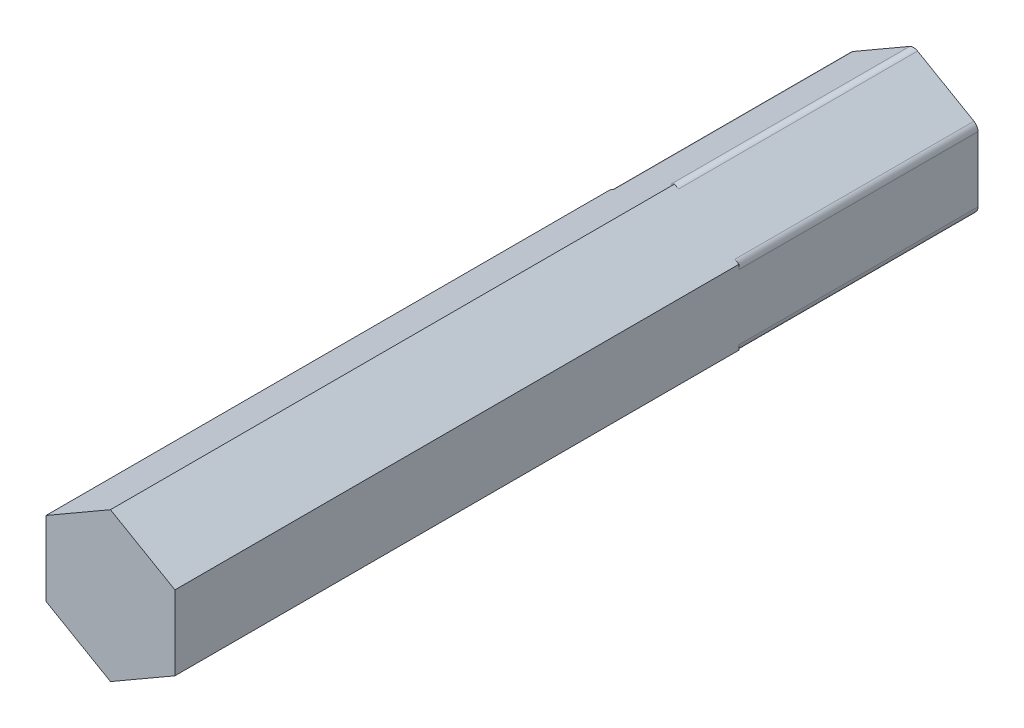
ISO-10303-21;
HEADER;
FILE_DESCRIPTION(('STEP AP214'),'2;1');
FILE_NAME('part.step','',(''),(''),'','','');
FILE_SCHEMA(('AUTOMOTIVE_DESIGN { 1 0 10303 214 1 1 1 1 }'));
ENDSEC;
DATA;
#1=APPLICATION_CONTEXT('core data for automotive mechanical design processes');
#2=APPLICATION_PROTOCOL_DEFINITION('international standard','automotive_design',2000,#1);
#3=PRODUCT_CONTEXT('',#1,'mechanical');
#4=PRODUCT('Part','Part','',(#3));
#5=PRODUCT_RELATED_PRODUCT_CATEGORY('part','',(#4));
#6=PRODUCT_DEFINITION_FORMATION('','',#4);
#7=PRODUCT_DEFINITION_CONTEXT('part definition',#1,'design');
#8=PRODUCT_DEFINITION('design','',#6,#7);
#9=PRODUCT_DEFINITION_SHAPE('','',#8);
#10=(LENGTH_UNIT() NAMED_UNIT(*) SI_UNIT(.MILLI.,.METRE.));
#11=(NAMED_UNIT(*) PLANE_ANGLE_UNIT() SI_UNIT($,.RADIAN.));
#12=(NAMED_UNIT(*) SI_UNIT($,.STERADIAN.) SOLID_ANGLE_UNIT());
#13=UNCERTAINTY_MEASURE_WITH_UNIT(LENGTH_MEASURE(1.E-05),#10,'distance_accuracy_value','');
#14=(GEOMETRIC_REPRESENTATION_CONTEXT(3) GLOBAL_UNCERTAINTY_ASSIGNED_CONTEXT((#13)) GLOBAL_UNIT_ASSIGNED_CONTEXT((#10,
#11,#12)) REPRESENTATION_CONTEXT('',''));
#15=CARTESIAN_POINT('',(0.,0.,0.));
#16=DIRECTION('',(0.,0.,1.));
#17=DIRECTION('',(1.,0.,0.));
#18=AXIS2_PLACEMENT_3D('',#15,#16,#17);
#19=CARTESIAN_POINT('',(12.,6.92820323027551,32.8394154211888));
#20=DIRECTION('',(0.5,0.866025403784439,0.));
#21=DIRECTION('',(-0.866025403784439,0.5,0.));
#22=AXIS2_PLACEMENT_3D('',#19,#20,#21);
#23=PLANE('',#22);
#24=DIRECTION('',(0.866025403784439,-0.5,0.));
#25=VECTOR('',#24,1.);
#26=CARTESIAN_POINT('',(12.,6.92820323027551,69.5000209808355));
#27=LINE('',#26,#25);
#28=CARTESIAN_POINT('',(0.749999999999999,13.4233937586588,69.5000209808355));
#29=VERTEX_POINT('',#28);
#30=CARTESIAN_POINT('',(11.25,7.36121593216773,69.5000209808355));
#31=VERTEX_POINT('',#30);
#32=EDGE_CURVE('E196',#29,#31,#27,.T.);
#33=ORIENTED_EDGE('',*,*,#32,.F.);
#34=DIRECTION('',(0.,0.,-1.));
#35=VECTOR('',#34,1.);
#36=CARTESIAN_POINT('',(0.750000000000003,13.4233937586588,114.000020980836));
#37=LINE('',#36,#35);
#38=CARTESIAN_POINT('',(0.750000000000003,13.4233937586588,114.000020980836));
#39=VERTEX_POINT('',#38);
#40=EDGE_CURVE('E186',#39,#29,#37,.T.);
#41=ORIENTED_EDGE('',*,*,#40,.F.);
#42=DIRECTION('',(-0.866025403784439,0.5,0.));
#43=VECTOR('',#42,1.);
#44=CARTESIAN_POINT('',(12.,6.92820323027551,114.000020980836));
#45=LINE('',#44,#43);
#46=CARTESIAN_POINT('',(0.,13.856406460551,114.000020980836));
#47=VERTEX_POINT('',#46);
#48=EDGE_CURVE('E172',#39,#47,#45,.T.);
#49=ORIENTED_EDGE('',*,*,#48,.T.);
#50=DIRECTION('',(0.,0.,1.));
#51=VECTOR('',#50,1.);
#52=CARTESIAN_POINT('',(0.,13.856406460551,32.8394154211888));
#53=LINE('',#52,#51);
#54=CARTESIAN_POINT('',(0.,13.856406460551,219.000011994922));
#55=VERTEX_POINT('',#54);
#56=EDGE_CURVE('E248',#47,#55,#53,.T.);
#57=ORIENTED_EDGE('',*,*,#56,.T.);
#58=DIRECTION('',(-0.866025403784439,0.5,0.));
#59=VECTOR('',#58,1.);
#60=CARTESIAN_POINT('',(12.,6.92820323027551,219.000011994922));
#61=LINE('',#60,#59);
#62=CARTESIAN_POINT('',(12.,6.92820323027551,219.000011994922));
#63=VERTEX_POINT('',#62);
#64=EDGE_CURVE('E230',#63,#55,#61,.T.);
#65=ORIENTED_EDGE('',*,*,#64,.F.);
#66=DIRECTION('',(0.,0.,1.));
#67=VECTOR('',#66,1.);
#68=CARTESIAN_POINT('',(12.,6.92820323027551,32.8394154211888));
#69=LINE('',#68,#67);
#70=CARTESIAN_POINT('',(12.,6.92820323027551,114.000020980836));
#71=VERTEX_POINT('',#70);
#72=EDGE_CURVE('E219',#71,#63,#69,.T.);
#73=ORIENTED_EDGE('',*,*,#72,.F.);
#74=CARTESIAN_POINT('',(11.25,7.36121593216773,114.000020980836));
#75=VERTEX_POINT('',#74);
#76=EDGE_CURVE('E183',#71,#75,#45,.T.);
#77=ORIENTED_EDGE('',*,*,#76,.T.);
#78=DIRECTION('',(0.,0.,-1.));
#79=VECTOR('',#78,1.);
#80=CARTESIAN_POINT('',(11.25,7.36121593216773,114.000020980836));
#81=LINE('',#80,#79);
#82=EDGE_CURVE('E311',#75,#31,#81,.T.);
#83=ORIENTED_EDGE('',*,*,#82,.T.);
#84=EDGE_LOOP('',(#33,#41,#49,#57,#65,#73,#77,#83));
#85=FACE_BOUND('',#84,.T.);
#86=ADVANCED_FACE('F46',(#85),#23,.T.);
#87=CARTESIAN_POINT('',(12.,-6.92820323027551,32.8394154211888));
#88=DIRECTION('',(1.,0.,0.));
#89=DIRECTION('',(0.,1.,0.));
#90=AXIS2_PLACEMENT_3D('',#87,#88,#89);
#91=PLANE('',#90);
#92=DIRECTION('',(0.,0.,-1.));
#93=VECTOR('',#92,1.);
#94=CARTESIAN_POINT('',(12.,6.06217782649106,114.000020980836));
#95=LINE('',#94,#93);
#96=CARTESIAN_POINT('',(12.,6.06217782649106,114.000020980836));
#97=VERTEX_POINT('',#96);
#98=CARTESIAN_POINT('',(12.,6.06217782649107,69.5000209808355));
#99=VERTEX_POINT('',#98);
#100=EDGE_CURVE('E307',#97,#99,#95,.T.);
#101=ORIENTED_EDGE('',*,*,#100,.F.);
#102=DIRECTION('',(0.,1.,0.));
#103=VECTOR('',#102,1.);
#104=CARTESIAN_POINT('',(12.,-6.92820323027551,114.000020980836));
#105=LINE('',#104,#103);
#106=EDGE_CURVE('E214',#97,#71,#105,.T.);
#107=ORIENTED_EDGE('',*,*,#106,.T.);
#108=ORIENTED_EDGE('',*,*,#72,.T.);
#109=DIRECTION('',(0.,1.,0.));
#110=VECTOR('',#109,1.);
#111=CARTESIAN_POINT('',(12.,-6.92820323027551,219.000011994922));
#112=LINE('',#111,#110);
#113=CARTESIAN_POINT('',(12.,-6.92820323027551,219.000011994922));
#114=VERTEX_POINT('',#113);
#115=EDGE_CURVE('E245',#114,#63,#112,.T.);
#116=ORIENTED_EDGE('',*,*,#115,.F.);
#117=DIRECTION('',(0.,0.,1.));
#118=VECTOR('',#117,1.);
#119=CARTESIAN_POINT('',(12.,-6.92820323027551,32.8394154211888));
#120=LINE('',#119,#118);
#121=CARTESIAN_POINT('',(12.,-6.92820323027551,114.000020980836));
#122=VERTEX_POINT('',#121);
#123=EDGE_CURVE('E250',#122,#114,#120,.T.);
#124=ORIENTED_EDGE('',*,*,#123,.F.);
#125=CARTESIAN_POINT('',(12.,-6.06217782649107,114.000020980836));
#126=VERTEX_POINT('',#125);
#127=EDGE_CURVE('E211',#122,#126,#105,.T.);
#128=ORIENTED_EDGE('',*,*,#127,.T.);
#129=DIRECTION('',(0.,0.,-1.));
#130=VECTOR('',#129,1.);
#131=CARTESIAN_POINT('',(12.,-6.06217782649107,114.000020980836));
#132=LINE('',#131,#130);
#133=CARTESIAN_POINT('',(12.,-6.06217782649107,69.5000209808355));
#134=VERTEX_POINT('',#133);
#135=EDGE_CURVE('E294',#126,#134,#132,.T.);
#136=ORIENTED_EDGE('',*,*,#135,.T.);
#137=DIRECTION('',(0.,-1.,0.));
#138=VECTOR('',#137,1.);
#139=CARTESIAN_POINT('',(12.,-6.92820323027551,69.5000209808355));
#140=LINE('',#139,#138);
#141=EDGE_CURVE('E225',#99,#134,#140,.T.);
#142=ORIENTED_EDGE('',*,*,#141,.F.);
#143=EDGE_LOOP('',(#101,#107,#108,#116,#124,#128,#136,#142));
#144=FACE_BOUND('',#143,.T.);
#145=ADVANCED_FACE('F283',(#144),#91,.T.);
#146=CARTESIAN_POINT('',(0.,-13.856406460551,32.8394154211888));
#147=DIRECTION('',(0.5,-0.866025403784439,0.));
#148=DIRECTION('',(0.866025403784439,0.5,0.));
#149=AXIS2_PLACEMENT_3D('',#146,#147,#148);
#150=PLANE('',#149);
#151=DIRECTION('',(0.,0.,-1.));
#152=VECTOR('',#151,1.);
#153=CARTESIAN_POINT('',(11.25,-7.36121593216773,114.000020980836));
#154=LINE('',#153,#152);
#155=CARTESIAN_POINT('',(11.25,-7.36121593216773,114.000020980836));
#156=VERTEX_POINT('',#155);
#157=CARTESIAN_POINT('',(11.25,-7.36121593216773,69.5000209808355));
#158=VERTEX_POINT('',#157);
#159=EDGE_CURVE('E306',#156,#158,#154,.T.);
#160=ORIENTED_EDGE('',*,*,#159,.F.);
#161=DIRECTION('',(0.866025403784439,0.5,0.));
#162=VECTOR('',#161,1.);
#163=CARTESIAN_POINT('',(0.,-13.856406460551,114.000020980836));
#164=LINE('',#163,#162);
#165=EDGE_CURVE('E210',#156,#122,#164,.T.);
#166=ORIENTED_EDGE('',*,*,#165,.T.);
#167=ORIENTED_EDGE('',*,*,#123,.T.);
#168=DIRECTION('',(0.866025403784439,0.5,0.));
#169=VECTOR('',#168,1.);
#170=CARTESIAN_POINT('',(0.,-13.856406460551,219.000011994922));
#171=LINE('',#170,#169);
#172=CARTESIAN_POINT('',(0.,-13.856406460551,219.000011994922));
#173=VERTEX_POINT('',#172);
#174=EDGE_CURVE('E242',#173,#114,#171,.T.);
#175=ORIENTED_EDGE('',*,*,#174,.F.);
#176=DIRECTION('',(0.,0.,1.));
#177=VECTOR('',#176,1.);
#178=CARTESIAN_POINT('',(0.,-13.856406460551,32.8394154211888));
#179=LINE('',#178,#177);
#180=CARTESIAN_POINT('',(0.,-13.856406460551,114.000020980836));
#181=VERTEX_POINT('',#180);
#182=EDGE_CURVE('E252',#181,#173,#179,.T.);
#183=ORIENTED_EDGE('',*,*,#182,.F.);
#184=CARTESIAN_POINT('',(0.750000000000014,-13.4233937586588,114.000020980836));
#185=VERTEX_POINT('',#184);
#186=EDGE_CURVE('E207',#181,#185,#164,.T.);
#187=ORIENTED_EDGE('',*,*,#186,.T.);
#188=DIRECTION('',(0.,0.,-1.));
#189=VECTOR('',#188,1.);
#190=CARTESIAN_POINT('',(0.750000000000014,-13.4233937586588,114.000020980836));
#191=LINE('',#190,#189);
#192=CARTESIAN_POINT('',(0.750000000000014,-13.4233937586588,69.5000209808355));
#193=VERTEX_POINT('',#192);
#194=EDGE_CURVE('E309',#185,#193,#191,.T.);
#195=ORIENTED_EDGE('',*,*,#194,.T.);
#196=DIRECTION('',(-0.866025403784439,-0.5,0.));
#197=VECTOR('',#196,1.);
#198=CARTESIAN_POINT('',(0.,-13.856406460551,69.5000209808355));
#199=LINE('',#198,#197);
#200=EDGE_CURVE('E222',#158,#193,#199,.T.);
#201=ORIENTED_EDGE('',*,*,#200,.F.);
#202=EDGE_LOOP('',(#160,#166,#167,#175,#183,#187,#195,#201));
#203=FACE_BOUND('',#202,.T.);
#204=ADVANCED_FACE('F289',(#203),#150,.T.);
#205=CARTESIAN_POINT('',(-12.,-6.92820323027551,32.8394154211888));
#206=DIRECTION('',(-0.5,-0.866025403784439,0.));
#207=DIRECTION('',(0.866025403784439,-0.5,0.));
#208=AXIS2_PLACEMENT_3D('',#205,#206,#207);
#209=PLANE('',#208);
#210=DIRECTION('',(0.,0.,-1.));
#211=VECTOR('',#210,1.);
#212=CARTESIAN_POINT('',(-0.749999999999994,-13.4233937586588,114.000020980836));
#213=LINE('',#212,#211);
#214=CARTESIAN_POINT('',(-0.749999999999994,-13.4233937586588,114.000020980836));
#215=VERTEX_POINT('',#214);
#216=CARTESIAN_POINT('',(-0.74999999999999,-13.4233937586588,69.5000209808355));
#217=VERTEX_POINT('',#216);
#218=EDGE_CURVE('E317',#215,#217,#213,.T.);
#219=ORIENTED_EDGE('',*,*,#218,.F.);
#220=DIRECTION('',(0.866025403784439,-0.5,0.));
#221=VECTOR('',#220,1.);
#222=CARTESIAN_POINT('',(-12.,-6.92820323027551,114.000020980836));
#223=LINE('',#222,#221);
#224=EDGE_CURVE('E206',#215,#181,#223,.T.);
#225=ORIENTED_EDGE('',*,*,#224,.T.);
#226=ORIENTED_EDGE('',*,*,#182,.T.);
#227=DIRECTION('',(0.866025403784439,-0.5,0.));
#228=VECTOR('',#227,1.);
#229=CARTESIAN_POINT('',(-12.,-6.92820323027551,219.000011994922));
#230=LINE('',#229,#228);
#231=CARTESIAN_POINT('',(-12.,-6.92820323027551,219.000011994922));
#232=VERTEX_POINT('',#231);
#233=EDGE_CURVE('E239',#232,#173,#230,.T.);
#234=ORIENTED_EDGE('',*,*,#233,.F.);
#235=DIRECTION('',(0.,0.,1.));
#236=VECTOR('',#235,1.);
#237=CARTESIAN_POINT('',(-12.,-6.92820323027551,32.8394154211888));
#238=LINE('',#237,#236);
#239=CARTESIAN_POINT('',(-12.,-6.92820323027551,114.000020980836));
#240=VERTEX_POINT('',#239);
#241=EDGE_CURVE('E254',#240,#232,#238,.T.);
#242=ORIENTED_EDGE('',*,*,#241,.F.);
#243=CARTESIAN_POINT('',(-11.25,-7.36121593216773,114.000020980836));
#244=VERTEX_POINT('',#243);
#245=EDGE_CURVE('E203',#240,#244,#223,.T.);
#246=ORIENTED_EDGE('',*,*,#245,.T.);
#247=DIRECTION('',(0.,0.,-1.));
#248=VECTOR('',#247,1.);
#249=CARTESIAN_POINT('',(-11.25,-7.36121593216773,114.000020980836));
#250=LINE('',#249,#248);
#251=CARTESIAN_POINT('',(-11.25,-7.36121593216773,69.5000209808355));
#252=VERTEX_POINT('',#251);
#253=EDGE_CURVE('E319',#244,#252,#250,.T.);
#254=ORIENTED_EDGE('',*,*,#253,.T.);
#255=DIRECTION('',(-0.866025403784439,0.5,0.));
#256=VECTOR('',#255,1.);
#257=CARTESIAN_POINT('',(-12.,-6.92820323027551,69.5000209808355));
#258=LINE('',#257,#256);
#259=EDGE_CURVE('E218',#217,#252,#258,.T.);
#260=ORIENTED_EDGE('',*,*,#259,.F.);
#261=EDGE_LOOP('',(#219,#225,#226,#234,#242,#246,#254,#260));
#262=FACE_BOUND('',#261,.T.);
#263=ADVANCED_FACE('F369',(#262),#209,.T.);
#264=CARTESIAN_POINT('',(-12.,6.92820323027551,32.8394154211888));
#265=DIRECTION('',(-1.,0.,0.));
#266=DIRECTION('',(0.,-1.,0.));
#267=AXIS2_PLACEMENT_3D('',#264,#265,#266);
#268=PLANE('',#267);
#269=DIRECTION('',(0.,0.,-1.));
#270=VECTOR('',#269,1.);
#271=CARTESIAN_POINT('',(-12.,-6.06217782649107,114.000020980836));
#272=LINE('',#271,#270);
#273=CARTESIAN_POINT('',(-12.,-6.06217782649107,114.000020980836));
#274=VERTEX_POINT('',#273);
#275=CARTESIAN_POINT('',(-12.,-6.06217782649107,69.5000209808355));
#276=VERTEX_POINT('',#275);
#277=EDGE_CURVE('E69',#274,#276,#272,.T.);
#278=ORIENTED_EDGE('',*,*,#277,.F.);
#279=DIRECTION('',(0.,-1.,0.));
#280=VECTOR('',#279,1.);
#281=CARTESIAN_POINT('',(-12.,6.92820323027551,114.000020980836));
#282=LINE('',#281,#280);
#283=EDGE_CURVE('E180',#274,#240,#282,.T.);
#284=ORIENTED_EDGE('',*,*,#283,.T.);
#285=ORIENTED_EDGE('',*,*,#241,.T.);
#286=DIRECTION('',(0.,-1.,0.));
#287=VECTOR('',#286,1.);
#288=CARTESIAN_POINT('',(-12.,6.92820323027551,219.000011994922));
#289=LINE('',#288,#287);
#290=CARTESIAN_POINT('',(-12.,6.92820323027551,219.000011994922));
#291=VERTEX_POINT('',#290);
#292=EDGE_CURVE('E236',#291,#232,#289,.T.);
#293=ORIENTED_EDGE('',*,*,#292,.F.);
#294=DIRECTION('',(0.,0.,1.));
#295=VECTOR('',#294,1.);
#296=CARTESIAN_POINT('',(-12.,6.92820323027551,32.8394154211888));
#297=LINE('',#296,#295);
#298=CARTESIAN_POINT('',(-12.,6.92820323027551,114.000020980836));
#299=VERTEX_POINT('',#298);
#300=EDGE_CURVE('E256',#299,#291,#297,.T.);
#301=ORIENTED_EDGE('',*,*,#300,.F.);
#302=CARTESIAN_POINT('',(-12.,6.06217782649106,114.000020980836));
#303=VERTEX_POINT('',#302);
#304=EDGE_CURVE('E181',#299,#303,#282,.T.);
#305=ORIENTED_EDGE('',*,*,#304,.T.);
#306=DIRECTION('',(0.,0.,-1.));
#307=VECTOR('',#306,1.);
#308=CARTESIAN_POINT('',(-12.,6.06217782649106,114.000020980836));
#309=LINE('',#308,#307);
#310=CARTESIAN_POINT('',(-12.,6.06217782649106,69.5000209808355));
#311=VERTEX_POINT('',#310);
#312=EDGE_CURVE('E323',#303,#311,#309,.T.);
#313=ORIENTED_EDGE('',*,*,#312,.T.);
#314=DIRECTION('',(0.,1.,0.));
#315=VECTOR('',#314,1.);
#316=CARTESIAN_POINT('',(-12.,6.92820323027551,69.5000209808355));
#317=LINE('',#316,#315);
#318=EDGE_CURVE('E215',#276,#311,#317,.T.);
#319=ORIENTED_EDGE('',*,*,#318,.F.);
#320=EDGE_LOOP('',(#278,#284,#285,#293,#301,#305,#313,#319));
#321=FACE_BOUND('',#320,.T.);
#322=ADVANCED_FACE('F269',(#321),#268,.T.);
#323=CARTESIAN_POINT('',(0.,13.856406460551,32.8394154211888));
#324=DIRECTION('',(-0.5,0.866025403784439,0.));
#325=DIRECTION('',(-0.866025403784439,-0.5,0.));
#326=AXIS2_PLACEMENT_3D('',#323,#324,#325);
#327=PLANE('',#326);
#328=DIRECTION('',(0.,0.,-1.));
#329=VECTOR('',#328,1.);
#330=CARTESIAN_POINT('',(-11.25,7.36121593216773,114.000020980836));
#331=LINE('',#330,#329);
#332=CARTESIAN_POINT('',(-11.25,7.36121593216773,114.000020980836));
#333=VERTEX_POINT('',#332);
#334=CARTESIAN_POINT('',(-11.25,7.36121593216773,69.5000209808355));
#335=VERTEX_POINT('',#334);
#336=EDGE_CURVE('E61',#333,#335,#331,.T.);
#337=ORIENTED_EDGE('',*,*,#336,.F.);
#338=DIRECTION('',(-0.866025403784439,-0.5,0.));
#339=VECTOR('',#338,1.);
#340=CARTESIAN_POINT('',(0.,13.856406460551,114.000020980836));
#341=LINE('',#340,#339);
#342=EDGE_CURVE('E50',#333,#299,#341,.T.);
#343=ORIENTED_EDGE('',*,*,#342,.T.);
#344=ORIENTED_EDGE('',*,*,#300,.T.);
#345=DIRECTION('',(-0.866025403784439,-0.5,0.));
#346=VECTOR('',#345,1.);
#347=CARTESIAN_POINT('',(0.,13.856406460551,219.000011994922));
#348=LINE('',#347,#346);
#349=EDGE_CURVE('E233',#55,#291,#348,.T.);
#350=ORIENTED_EDGE('',*,*,#349,.F.);
#351=ORIENTED_EDGE('',*,*,#56,.F.);
#352=CARTESIAN_POINT('',(-0.750000000000006,13.4233937586588,114.000020980836));
#353=VERTEX_POINT('',#352);
#354=EDGE_CURVE('E12',#47,#353,#341,.T.);
#355=ORIENTED_EDGE('',*,*,#354,.T.);
#356=DIRECTION('',(0.,0.,-1.));
#357=VECTOR('',#356,1.);
#358=CARTESIAN_POINT('',(-0.750000000000006,13.4233937586588,114.000020980836));
#359=LINE('',#358,#357);
#360=CARTESIAN_POINT('',(-0.750000000000006,13.4233937586588,69.5000209808355));
#361=VERTEX_POINT('',#360);
#362=EDGE_CURVE('E189',#353,#361,#359,.T.);
#363=ORIENTED_EDGE('',*,*,#362,.T.);
#364=DIRECTION('',(0.866025403784439,0.5,0.));
#365=VECTOR('',#364,1.);
#366=CARTESIAN_POINT('',(0.,13.856406460551,69.5000209808355));
#367=LINE('',#366,#365);
#368=EDGE_CURVE('E229',#335,#361,#367,.T.);
#369=ORIENTED_EDGE('',*,*,#368,.F.);
#370=EDGE_LOOP('',(#337,#343,#344,#350,#351,#355,#363,#369));
#371=FACE_BOUND('',#370,.T.);
#372=ADVANCED_FACE('F264',(#371),#327,.T.);
#373=CARTESIAN_POINT('',(0.,-2.46469511466785E-13,69.5000209808355));
#374=DIRECTION('',(0.,0.,1.));
#375=DIRECTION('',(1.,0.,0.));
#376=AXIS2_PLACEMENT_3D('',#373,#374,#375);
#377=PLANE('',#376);
#378=ORIENTED_EDGE('',*,*,#368,.T.);
#379=CARTESIAN_POINT('',(0.,12.1243556529821,69.5000209808355));
#380=DIRECTION('',(0.,0.,1.));
#381=DIRECTION('',(1.,0.,0.));
#382=AXIS2_PLACEMENT_3D('',#379,#380,#381);
#383=CIRCLE('',#382,1.5);
#384=EDGE_CURVE('E334',#29,#361,#383,.T.);
#385=ORIENTED_EDGE('',*,*,#384,.F.);
#386=ORIENTED_EDGE('',*,*,#32,.T.);
#387=CARTESIAN_POINT('',(10.5,6.06217782649107,69.5000209808355));
#388=DIRECTION('',(0.,0.,1.));
#389=DIRECTION('',(1.,0.,0.));
#390=AXIS2_PLACEMENT_3D('',#387,#388,#389);
#391=CIRCLE('',#390,1.5);
#392=EDGE_CURVE('E191',#99,#31,#391,.T.);
#393=ORIENTED_EDGE('',*,*,#392,.F.);
#394=ORIENTED_EDGE('',*,*,#141,.T.);
#395=CARTESIAN_POINT('',(10.5,-6.06217782649107,69.5000209808355));
#396=DIRECTION('',(0.,0.,1.));
#397=DIRECTION('',(1.,0.,0.));
#398=AXIS2_PLACEMENT_3D('',#395,#396,#397);
#399=CIRCLE('',#398,1.5);
#400=EDGE_CURVE('E305',#158,#134,#399,.T.);
#401=ORIENTED_EDGE('',*,*,#400,.F.);
#402=ORIENTED_EDGE('',*,*,#200,.T.);
#403=CARTESIAN_POINT('',(0.,-12.1243556529821,69.5000209808355));
#404=DIRECTION('',(0.,0.,1.));
#405=DIRECTION('',(1.,0.,0.));
#406=AXIS2_PLACEMENT_3D('',#403,#404,#405);
#407=CIRCLE('',#406,1.5);
#408=EDGE_CURVE('E331',#217,#193,#407,.T.);
#409=ORIENTED_EDGE('',*,*,#408,.F.);
#410=ORIENTED_EDGE('',*,*,#259,.T.);
#411=CARTESIAN_POINT('',(-10.5,-6.06217782649107,69.5000209808355));
#412=DIRECTION('',(0.,0.,1.));
#413=DIRECTION('',(1.,0.,0.));
#414=AXIS2_PLACEMENT_3D('',#411,#412,#413);
#415=CIRCLE('',#414,1.5);
#416=EDGE_CURVE('E327',#276,#252,#415,.T.);
#417=ORIENTED_EDGE('',*,*,#416,.F.);
#418=ORIENTED_EDGE('',*,*,#318,.T.);
#419=CARTESIAN_POINT('',(-10.5,6.06217782649107,69.5000209808355));
#420=DIRECTION('',(0.,0.,1.));
#421=DIRECTION('',(1.,0.,0.));
#422=AXIS2_PLACEMENT_3D('',#419,#420,#421);
#423=CIRCLE('',#422,1.5);
#424=EDGE_CURVE('E326',#335,#311,#423,.T.);
#425=ORIENTED_EDGE('',*,*,#424,.F.);
#426=EDGE_LOOP('',(#378,#385,#386,#393,#394,#401,#402,#409,#410,#417,#418,#425));
#427=FACE_BOUND('',#426,.T.);
#428=ADVANCED_FACE('F48',(#427),#377,.F.);
#429=CARTESIAN_POINT('',(0.,-2.46469511466785E-13,219.000011994922));
#430=DIRECTION('',(0.,0.,1.));
#431=DIRECTION('',(1.,0.,0.));
#432=AXIS2_PLACEMENT_3D('',#429,#430,#431);
#433=PLANE('',#432);
#434=ORIENTED_EDGE('',*,*,#233,.T.);
#435=ORIENTED_EDGE('',*,*,#174,.T.);
#436=ORIENTED_EDGE('',*,*,#115,.T.);
#437=ORIENTED_EDGE('',*,*,#64,.T.);
#438=ORIENTED_EDGE('',*,*,#349,.T.);
#439=ORIENTED_EDGE('',*,*,#292,.T.);
#440=EDGE_LOOP('',(#434,#435,#436,#437,#438,#439));
#441=FACE_BOUND('',#440,.T.);
#442=ADVANCED_FACE('F275',(#441),#433,.T.);
#443=CARTESIAN_POINT('',(10.5,6.06217782649107,114.000020980836));
#444=DIRECTION('',(0.,0.,-1.));
#445=DIRECTION('',(-1.,0.,0.));
#446=AXIS2_PLACEMENT_3D('',#443,#444,#445);
#447=CYLINDRICAL_SURFACE('',#446,1.5);
#448=ORIENTED_EDGE('',*,*,#392,.T.);
#449=ORIENTED_EDGE('',*,*,#82,.F.);
#450=CARTESIAN_POINT('',(10.5,6.06217782649107,114.000020980836));
#451=DIRECTION('',(0.,0.,1.));
#452=DIRECTION('',(1.,0.,0.));
#453=AXIS2_PLACEMENT_3D('',#450,#451,#452);
#454=CIRCLE('',#453,1.5);
#455=EDGE_CURVE('E300',#97,#75,#454,.T.);
#456=ORIENTED_EDGE('',*,*,#455,.F.);
#457=ORIENTED_EDGE('',*,*,#100,.T.);
#458=EDGE_LOOP('',(#448,#449,#456,#457));
#459=FACE_BOUND('',#458,.T.);
#460=ADVANCED_FACE('F346',(#459),#447,.T.);
#461=CARTESIAN_POINT('',(0.,0.,114.000020980836));
#462=DIRECTION('',(0.,0.,-1.));
#463=DIRECTION('',(-1.,0.,0.));
#464=AXIS2_PLACEMENT_3D('',#461,#462,#463);
#465=PLANE('',#464);
#466=ORIENTED_EDGE('',*,*,#106,.F.);
#467=ORIENTED_EDGE('',*,*,#455,.T.);
#468=ORIENTED_EDGE('',*,*,#76,.F.);
#469=EDGE_LOOP('',(#466,#467,#468));
#470=FACE_BOUND('',#469,.T.);
#471=ADVANCED_FACE('F348',(#470),#465,.T.);
#472=CARTESIAN_POINT('',(10.5,-6.06217782649107,114.000020980836));
#473=DIRECTION('',(0.,0.,-1.));
#474=DIRECTION('',(-1.,0.,0.));
#475=AXIS2_PLACEMENT_3D('',#472,#473,#474);
#476=CYLINDRICAL_SURFACE('',#475,1.5);
#477=ORIENTED_EDGE('',*,*,#400,.T.);
#478=ORIENTED_EDGE('',*,*,#135,.F.);
#479=CARTESIAN_POINT('',(10.5,-6.06217782649107,114.000020980836));
#480=DIRECTION('',(0.,0.,1.));
#481=DIRECTION('',(1.,0.,0.));
#482=AXIS2_PLACEMENT_3D('',#479,#480,#481);
#483=CIRCLE('',#482,1.5);
#484=EDGE_CURVE('E298',#156,#126,#483,.T.);
#485=ORIENTED_EDGE('',*,*,#484,.F.);
#486=ORIENTED_EDGE('',*,*,#159,.T.);
#487=EDGE_LOOP('',(#477,#478,#485,#486));
#488=FACE_BOUND('',#487,.T.);
#489=ADVANCED_FACE('F303',(#488),#476,.T.);
#490=ORIENTED_EDGE('',*,*,#165,.F.);
#491=ORIENTED_EDGE('',*,*,#484,.T.);
#492=ORIENTED_EDGE('',*,*,#127,.F.);
#493=EDGE_LOOP('',(#490,#491,#492));
#494=FACE_BOUND('',#493,.T.);
#495=ADVANCED_FACE('F296',(#494),#465,.T.);
#496=CARTESIAN_POINT('',(0.,-12.1243556529821,114.000020980836));
#497=DIRECTION('',(0.,0.,-1.));
#498=DIRECTION('',(-1.,0.,0.));
#499=AXIS2_PLACEMENT_3D('',#496,#497,#498);
#500=CYLINDRICAL_SURFACE('',#499,1.5);
#501=ORIENTED_EDGE('',*,*,#408,.T.);
#502=ORIENTED_EDGE('',*,*,#194,.F.);
#503=CARTESIAN_POINT('',(0.,-12.1243556529821,114.000020980836));
#504=DIRECTION('',(0.,0.,1.));
#505=DIRECTION('',(1.,0.,0.));
#506=AXIS2_PLACEMENT_3D('',#503,#504,#505);
#507=CIRCLE('',#506,1.5);
#508=EDGE_CURVE('E301',#215,#185,#507,.T.);
#509=ORIENTED_EDGE('',*,*,#508,.F.);
#510=ORIENTED_EDGE('',*,*,#218,.T.);
#511=EDGE_LOOP('',(#501,#502,#509,#510));
#512=FACE_BOUND('',#511,.T.);
#513=ADVANCED_FACE('F386',(#512),#500,.T.);
#514=ORIENTED_EDGE('',*,*,#224,.F.);
#515=ORIENTED_EDGE('',*,*,#508,.T.);
#516=ORIENTED_EDGE('',*,*,#186,.F.);
#517=EDGE_LOOP('',(#514,#515,#516));
#518=FACE_BOUND('',#517,.T.);
#519=ADVANCED_FACE('F385',(#518),#465,.T.);
#520=CARTESIAN_POINT('',(-10.5,-6.06217782649107,114.000020980836));
#521=DIRECTION('',(0.,0.,-1.));
#522=DIRECTION('',(-1.,0.,0.));
#523=AXIS2_PLACEMENT_3D('',#520,#521,#522);
#524=CYLINDRICAL_SURFACE('',#523,1.5);
#525=ORIENTED_EDGE('',*,*,#416,.T.);
#526=ORIENTED_EDGE('',*,*,#253,.F.);
#527=CARTESIAN_POINT('',(-10.5,-6.06217782649107,114.000020980836));
#528=DIRECTION('',(0.,0.,1.));
#529=DIRECTION('',(1.,0.,0.));
#530=AXIS2_PLACEMENT_3D('',#527,#528,#529);
#531=CIRCLE('',#530,1.5);
#532=EDGE_CURVE('E542',#274,#244,#531,.T.);
#533=ORIENTED_EDGE('',*,*,#532,.F.);
#534=ORIENTED_EDGE('',*,*,#277,.T.);
#535=EDGE_LOOP('',(#525,#526,#533,#534));
#536=FACE_BOUND('',#535,.T.);
#537=ADVANCED_FACE('F382',(#536),#524,.T.);
#538=ORIENTED_EDGE('',*,*,#283,.F.);
#539=ORIENTED_EDGE('',*,*,#532,.T.);
#540=ORIENTED_EDGE('',*,*,#245,.F.);
#541=EDGE_LOOP('',(#538,#539,#540));
#542=FACE_BOUND('',#541,.T.);
#543=ADVANCED_FACE('F381',(#542),#465,.T.);
#544=CARTESIAN_POINT('',(-10.5,6.06217782649107,114.000020980836));
#545=DIRECTION('',(0.,0.,-1.));
#546=DIRECTION('',(-1.,0.,0.));
#547=AXIS2_PLACEMENT_3D('',#544,#545,#546);
#548=CYLINDRICAL_SURFACE('',#547,1.5);
#549=ORIENTED_EDGE('',*,*,#424,.T.);
#550=ORIENTED_EDGE('',*,*,#312,.F.);
#551=CARTESIAN_POINT('',(-10.5,6.06217782649107,114.000020980836));
#552=DIRECTION('',(0.,0.,1.));
#553=DIRECTION('',(1.,0.,0.));
#554=AXIS2_PLACEMENT_3D('',#551,#552,#553);
#555=CIRCLE('',#554,1.5);
#556=EDGE_CURVE('E190',#333,#303,#555,.T.);
#557=ORIENTED_EDGE('',*,*,#556,.F.);
#558=ORIENTED_EDGE('',*,*,#336,.T.);
#559=EDGE_LOOP('',(#549,#550,#557,#558));
#560=FACE_BOUND('',#559,.T.);
#561=ADVANCED_FACE('F376',(#560),#548,.T.);
#562=ORIENTED_EDGE('',*,*,#342,.F.);
#563=ORIENTED_EDGE('',*,*,#556,.T.);
#564=ORIENTED_EDGE('',*,*,#304,.F.);
#565=EDGE_LOOP('',(#562,#563,#564));
#566=FACE_BOUND('',#565,.T.);
#567=ADVANCED_FACE('F355',(#566),#465,.T.);
#568=CARTESIAN_POINT('',(0.,12.1243556529821,114.000020980836));
#569=DIRECTION('',(0.,0.,1.));
#570=DIRECTION('',(1.,0.,0.));
#571=AXIS2_PLACEMENT_3D('',#568,#569,#570);
#572=CIRCLE('',#571,1.5);
#573=EDGE_CURVE('E175',#39,#353,#572,.T.);
#574=ORIENTED_EDGE('',*,*,#573,.T.);
#575=ORIENTED_EDGE('',*,*,#354,.F.);
#576=ORIENTED_EDGE('',*,*,#48,.F.);
#577=EDGE_LOOP('',(#574,#575,#576));
#578=FACE_BOUND('',#577,.T.);
#579=ADVANCED_FACE('F174',(#578),#465,.T.);
#580=CARTESIAN_POINT('',(0.,12.1243556529821,114.000020980836));
#581=DIRECTION('',(0.,0.,-1.));
#582=DIRECTION('',(-1.,0.,0.));
#583=AXIS2_PLACEMENT_3D('',#580,#581,#582);
#584=CYLINDRICAL_SURFACE('',#583,1.5);
#585=ORIENTED_EDGE('',*,*,#384,.T.);
#586=ORIENTED_EDGE('',*,*,#362,.F.);
#587=ORIENTED_EDGE('',*,*,#573,.F.);
#588=ORIENTED_EDGE('',*,*,#40,.T.);
#589=EDGE_LOOP('',(#585,#586,#587,#588));
#590=FACE_BOUND('',#589,.T.);
#591=ADVANCED_FACE('F185',(#590),#584,.T.);
#592=CLOSED_SHELL('',(#86,#145,#204,#263,#322,#372,#428,#442,#460,#471,#489,#495,#513,#519,#537,
#543,#561,#567,#579,#591));
#593=MANIFOLD_SOLID_BREP('B2',#592);
#594=ADVANCED_BREP_SHAPE_REPRESENTATION('',(#18,#593),#14);
#595=SHAPE_DEFINITION_REPRESENTATION(#9,#594);
ENDSEC;
END-ISO-10303-21;
